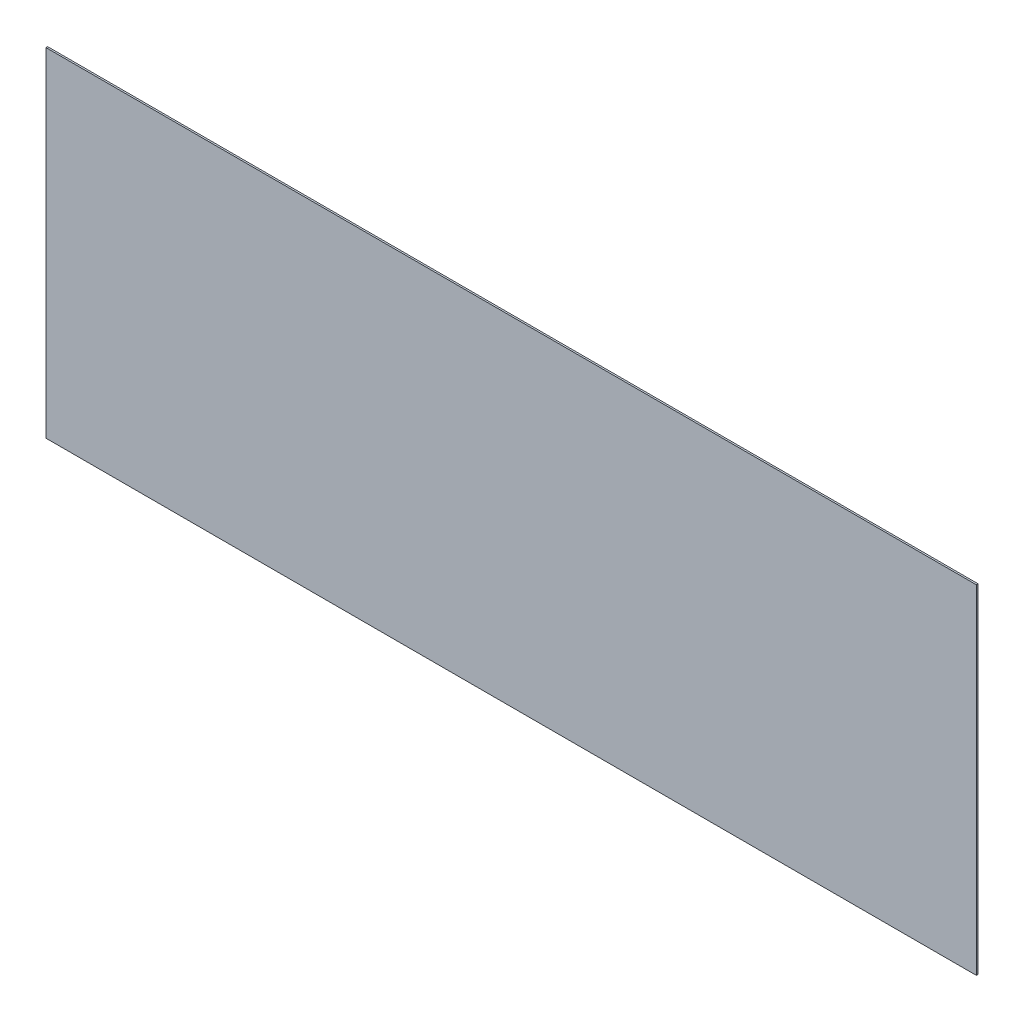
ISO-10303-21;
HEADER;
FILE_DESCRIPTION(('STEP AP214'),'2;1');
FILE_NAME('part.step','',(''),(''),'','','');
FILE_SCHEMA(('AUTOMOTIVE_DESIGN { 1 0 10303 214 1 1 1 1 }'));
ENDSEC;
DATA;
#1=APPLICATION_CONTEXT('core data for automotive mechanical design processes');
#2=APPLICATION_PROTOCOL_DEFINITION('international standard','automotive_design',2000,#1);
#3=PRODUCT_CONTEXT('',#1,'mechanical');
#4=PRODUCT('Part','Part','',(#3));
#5=PRODUCT_RELATED_PRODUCT_CATEGORY('part','',(#4));
#6=PRODUCT_DEFINITION_FORMATION('','',#4);
#7=PRODUCT_DEFINITION_CONTEXT('part definition',#1,'design');
#8=PRODUCT_DEFINITION('design','',#6,#7);
#9=PRODUCT_DEFINITION_SHAPE('','',#8);
#10=(LENGTH_UNIT() NAMED_UNIT(*) SI_UNIT(.MILLI.,.METRE.));
#11=(NAMED_UNIT(*) PLANE_ANGLE_UNIT() SI_UNIT($,.RADIAN.));
#12=(NAMED_UNIT(*) SI_UNIT($,.STERADIAN.) SOLID_ANGLE_UNIT());
#13=UNCERTAINTY_MEASURE_WITH_UNIT(LENGTH_MEASURE(1.E-05),#10,'distance_accuracy_value','');
#14=(GEOMETRIC_REPRESENTATION_CONTEXT(3) GLOBAL_UNCERTAINTY_ASSIGNED_CONTEXT((#13)) GLOBAL_UNIT_ASSIGNED_CONTEXT((#10,
#11,#12)) REPRESENTATION_CONTEXT('',''));
#15=CARTESIAN_POINT('',(0.,0.,0.));
#16=DIRECTION('',(0.,0.,1.));
#17=DIRECTION('',(1.,0.,0.));
#18=AXIS2_PLACEMENT_3D('',#15,#16,#17);
#19=CARTESIAN_POINT('',(-2750.,1000.,5.));
#20=DIRECTION('',(1.,0.,0.));
#21=DIRECTION('',(0.,1.,0.));
#22=AXIS2_PLACEMENT_3D('',#19,#20,#21);
#23=PLANE('',#22);
#24=DIRECTION('',(0.,-1.,0.));
#25=VECTOR('',#24,1.);
#26=CARTESIAN_POINT('',(-2750.,1000.,-5.));
#27=LINE('',#26,#25);
#28=CARTESIAN_POINT('',(-2750.,1000.,-5.));
#29=VERTEX_POINT('',#28);
#30=CARTESIAN_POINT('',(-2750.,-1000.,-5.));
#31=VERTEX_POINT('',#30);
#32=EDGE_CURVE('E96',#29,#31,#27,.T.);
#33=ORIENTED_EDGE('',*,*,#32,.T.);
#34=DIRECTION('',(0.,0.,-1.));
#35=VECTOR('',#34,1.);
#36=CARTESIAN_POINT('',(-2750.,-1000.,5.));
#37=LINE('',#36,#35);
#38=CARTESIAN_POINT('',(-2750.,-1000.,5.));
#39=VERTEX_POINT('',#38);
#40=EDGE_CURVE('E11',#39,#31,#37,.T.);
#41=ORIENTED_EDGE('',*,*,#40,.F.);
#42=DIRECTION('',(0.,-1.,0.));
#43=VECTOR('',#42,1.);
#44=CARTESIAN_POINT('',(-2750.,1000.,5.));
#45=LINE('',#44,#43);
#46=CARTESIAN_POINT('',(-2750.,1000.,5.));
#47=VERTEX_POINT('',#46);
#48=EDGE_CURVE('E84',#47,#39,#45,.T.);
#49=ORIENTED_EDGE('',*,*,#48,.F.);
#50=DIRECTION('',(0.,0.,-1.));
#51=VECTOR('',#50,1.);
#52=CARTESIAN_POINT('',(-2750.,1000.,5.));
#53=LINE('',#52,#51);
#54=EDGE_CURVE('E92',#47,#29,#53,.T.);
#55=ORIENTED_EDGE('',*,*,#54,.T.);
#56=EDGE_LOOP('',(#33,#41,#49,#55));
#57=FACE_BOUND('',#56,.T.);
#58=ADVANCED_FACE('F33',(#57),#23,.F.);
#59=CARTESIAN_POINT('',(2750.,-1000.,5.));
#60=DIRECTION('',(0.,1.,0.));
#61=DIRECTION('',(-1.,0.,0.));
#62=AXIS2_PLACEMENT_3D('',#59,#60,#61);
#63=PLANE('',#62);
#64=DIRECTION('',(1.,0.,0.));
#65=VECTOR('',#64,1.);
#66=CARTESIAN_POINT('',(2750.,-1000.,-5.));
#67=LINE('',#66,#65);
#68=CARTESIAN_POINT('',(2750.,-1000.,-5.));
#69=VERTEX_POINT('',#68);
#70=EDGE_CURVE('E88',#31,#69,#67,.T.);
#71=ORIENTED_EDGE('',*,*,#70,.T.);
#72=DIRECTION('',(0.,0.,-1.));
#73=VECTOR('',#72,1.);
#74=CARTESIAN_POINT('',(2750.,-1000.,5.));
#75=LINE('',#74,#73);
#76=CARTESIAN_POINT('',(2750.,-1000.,5.));
#77=VERTEX_POINT('',#76);
#78=EDGE_CURVE('E41',#77,#69,#75,.T.);
#79=ORIENTED_EDGE('',*,*,#78,.F.);
#80=DIRECTION('',(1.,0.,0.));
#81=VECTOR('',#80,1.);
#82=CARTESIAN_POINT('',(2750.,-1000.,5.));
#83=LINE('',#82,#81);
#84=EDGE_CURVE('E79',#39,#77,#83,.T.);
#85=ORIENTED_EDGE('',*,*,#84,.F.);
#86=ORIENTED_EDGE('',*,*,#40,.T.);
#87=EDGE_LOOP('',(#71,#79,#85,#86));
#88=FACE_BOUND('',#87,.T.);
#89=ADVANCED_FACE('F87',(#88),#63,.F.);
#90=CARTESIAN_POINT('',(2750.,1000.,5.));
#91=DIRECTION('',(-1.,0.,0.));
#92=DIRECTION('',(0.,-1.,0.));
#93=AXIS2_PLACEMENT_3D('',#90,#91,#92);
#94=PLANE('',#93);
#95=DIRECTION('',(0.,1.,0.));
#96=VECTOR('',#95,1.);
#97=CARTESIAN_POINT('',(2750.,1000.,-5.));
#98=LINE('',#97,#96);
#99=CARTESIAN_POINT('',(2750.,1000.,-5.));
#100=VERTEX_POINT('',#99);
#101=EDGE_CURVE('E66',#69,#100,#98,.T.);
#102=ORIENTED_EDGE('',*,*,#101,.T.);
#103=DIRECTION('',(0.,0.,-1.));
#104=VECTOR('',#103,1.);
#105=CARTESIAN_POINT('',(2750.,1000.,5.));
#106=LINE('',#105,#104);
#107=CARTESIAN_POINT('',(2750.,1000.,5.));
#108=VERTEX_POINT('',#107);
#109=EDGE_CURVE('E89',#108,#100,#106,.T.);
#110=ORIENTED_EDGE('',*,*,#109,.F.);
#111=DIRECTION('',(0.,1.,0.));
#112=VECTOR('',#111,1.);
#113=CARTESIAN_POINT('',(2750.,1000.,5.));
#114=LINE('',#113,#112);
#115=EDGE_CURVE('E82',#77,#108,#114,.T.);
#116=ORIENTED_EDGE('',*,*,#115,.F.);
#117=ORIENTED_EDGE('',*,*,#78,.T.);
#118=EDGE_LOOP('',(#102,#110,#116,#117));
#119=FACE_BOUND('',#118,.T.);
#120=ADVANCED_FACE('F90',(#119),#94,.F.);
#121=CARTESIAN_POINT('',(2750.,1000.,5.));
#122=DIRECTION('',(0.,-1.,0.));
#123=DIRECTION('',(1.,0.,0.));
#124=AXIS2_PLACEMENT_3D('',#121,#122,#123);
#125=PLANE('',#124);
#126=DIRECTION('',(-1.,0.,0.));
#127=VECTOR('',#126,1.);
#128=CARTESIAN_POINT('',(2750.,1000.,-5.));
#129=LINE('',#128,#127);
#130=EDGE_CURVE('E72',#100,#29,#129,.T.);
#131=ORIENTED_EDGE('',*,*,#130,.T.);
#132=ORIENTED_EDGE('',*,*,#54,.F.);
#133=DIRECTION('',(-1.,0.,0.));
#134=VECTOR('',#133,1.);
#135=CARTESIAN_POINT('',(2750.,1000.,5.));
#136=LINE('',#135,#134);
#137=EDGE_CURVE('E49',#108,#47,#136,.T.);
#138=ORIENTED_EDGE('',*,*,#137,.F.);
#139=ORIENTED_EDGE('',*,*,#109,.T.);
#140=EDGE_LOOP('',(#131,#132,#138,#139));
#141=FACE_BOUND('',#140,.T.);
#142=ADVANCED_FACE('F103',(#141),#125,.F.);
#143=CARTESIAN_POINT('',(0.,0.,5.));
#144=DIRECTION('',(0.,0.,-1.));
#145=DIRECTION('',(-1.,0.,0.));
#146=AXIS2_PLACEMENT_3D('',#143,#144,#145);
#147=PLANE('',#146);
#148=ORIENTED_EDGE('',*,*,#48,.T.);
#149=ORIENTED_EDGE('',*,*,#84,.T.);
#150=ORIENTED_EDGE('',*,*,#115,.T.);
#151=ORIENTED_EDGE('',*,*,#137,.T.);
#152=EDGE_LOOP('',(#148,#149,#150,#151));
#153=FACE_BOUND('',#152,.T.);
#154=ADVANCED_FACE('F80',(#153),#147,.F.);
#155=CARTESIAN_POINT('',(0.,0.,-5.));
#156=DIRECTION('',(0.,0.,-1.));
#157=DIRECTION('',(-1.,0.,0.));
#158=AXIS2_PLACEMENT_3D('',#155,#156,#157);
#159=PLANE('',#158);
#160=ORIENTED_EDGE('',*,*,#32,.F.);
#161=ORIENTED_EDGE('',*,*,#130,.F.);
#162=ORIENTED_EDGE('',*,*,#101,.F.);
#163=ORIENTED_EDGE('',*,*,#70,.F.);
#164=EDGE_LOOP('',(#160,#161,#162,#163));
#165=FACE_BOUND('',#164,.T.);
#166=ADVANCED_FACE('F106',(#165),#159,.T.);
#167=CLOSED_SHELL('',(#58,#89,#120,#142,#154,#166));
#168=MANIFOLD_SOLID_BREP('B2',#167);
#169=ADVANCED_BREP_SHAPE_REPRESENTATION('',(#18,#168),#14);
#170=SHAPE_DEFINITION_REPRESENTATION(#9,#169);
ENDSEC;
END-ISO-10303-21;
